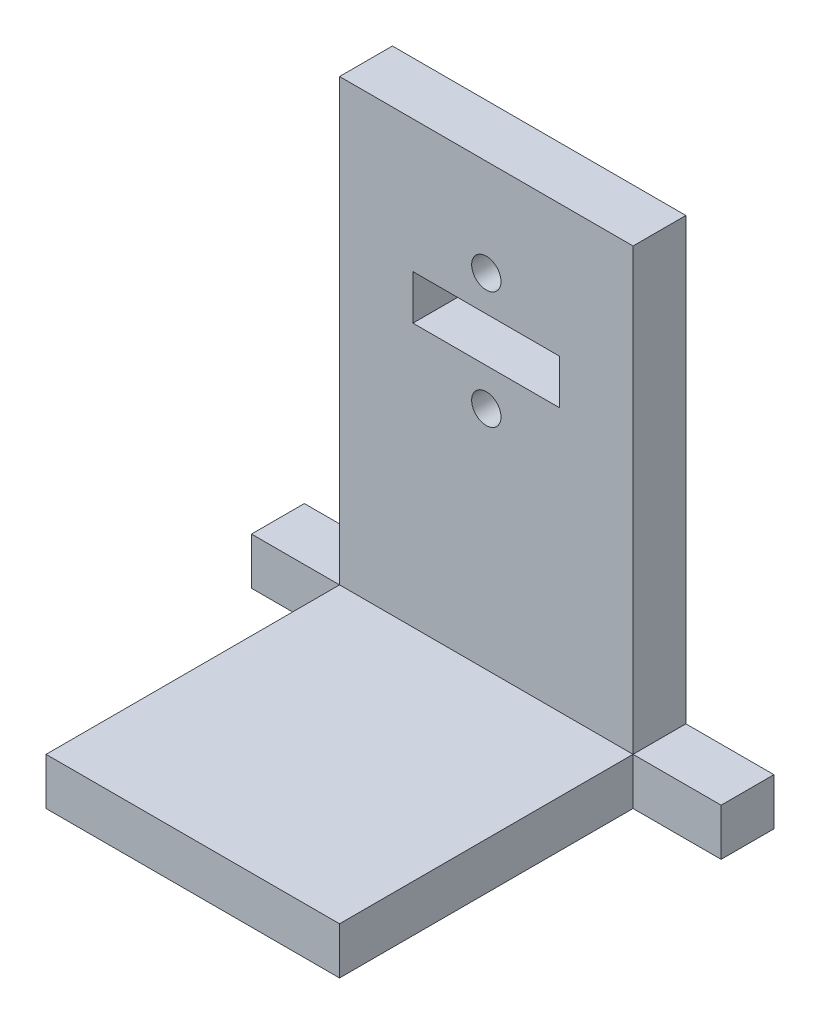
ISO-10303-21;
HEADER;
FILE_DESCRIPTION(('STEP AP214'),'2;1');
FILE_NAME('part.step','',(''),(''),'','','');
FILE_SCHEMA(('AUTOMOTIVE_DESIGN { 1 0 10303 214 1 1 1 1 }'));
ENDSEC;
DATA;
#1=APPLICATION_CONTEXT('core data for automotive mechanical design processes');
#2=APPLICATION_PROTOCOL_DEFINITION('international standard','automotive_design',2000,#1);
#3=PRODUCT_CONTEXT('',#1,'mechanical');
#4=PRODUCT('Part','Part','',(#3));
#5=PRODUCT_RELATED_PRODUCT_CATEGORY('part','',(#4));
#6=PRODUCT_DEFINITION_FORMATION('','',#4);
#7=PRODUCT_DEFINITION_CONTEXT('part definition',#1,'design');
#8=PRODUCT_DEFINITION('design','',#6,#7);
#9=PRODUCT_DEFINITION_SHAPE('','',#8);
#10=(LENGTH_UNIT() NAMED_UNIT(*) SI_UNIT(.MILLI.,.METRE.));
#11=(NAMED_UNIT(*) PLANE_ANGLE_UNIT() SI_UNIT($,.RADIAN.));
#12=(NAMED_UNIT(*) SI_UNIT($,.STERADIAN.) SOLID_ANGLE_UNIT());
#13=UNCERTAINTY_MEASURE_WITH_UNIT(LENGTH_MEASURE(1.E-05),#10,'distance_accuracy_value','');
#14=(GEOMETRIC_REPRESENTATION_CONTEXT(3) GLOBAL_UNCERTAINTY_ASSIGNED_CONTEXT((#13)) GLOBAL_UNIT_ASSIGNED_CONTEXT((#10,
#11,#12)) REPRESENTATION_CONTEXT('',''));
#15=CARTESIAN_POINT('',(0.,0.,0.));
#16=DIRECTION('',(0.,0.,1.));
#17=DIRECTION('',(1.,0.,0.));
#18=AXIS2_PLACEMENT_3D('',#15,#16,#17);
#19=CARTESIAN_POINT('',(0.,0.,0.));
#20=DIRECTION('',(0.,0.,1.));
#21=DIRECTION('',(1.,0.,0.));
#22=AXIS2_PLACEMENT_3D('',#19,#20,#21);
#23=PLANE('',#22);
#24=DIRECTION('',(0.,-1.,0.));
#25=VECTOR('',#24,1.);
#26=CARTESIAN_POINT('',(16.5532367821159,8.00000000000011,0.));
#27=LINE('',#26,#25);
#28=CARTESIAN_POINT('',(16.5532367821159,8.00000000000011,0.));
#29=VERTEX_POINT('',#28);
#30=CARTESIAN_POINT('',(16.5532367821159,0.,0.));
#31=VERTEX_POINT('',#30);
#32=EDGE_CURVE('E37',#29,#31,#27,.T.);
#33=ORIENTED_EDGE('',*,*,#32,.F.);
#34=DIRECTION('',(-1.,0.,0.));
#35=VECTOR('',#34,1.);
#36=CARTESIAN_POINT('',(16.5532367821159,8.00000000000011,0.));
#37=LINE('',#36,#35);
#38=CARTESIAN_POINT('',(1.55323678211588,8.00000000000011,0.));
#39=VERTEX_POINT('',#38);
#40=EDGE_CURVE('E206',#29,#39,#37,.T.);
#41=ORIENTED_EDGE('',*,*,#40,.T.);
#42=DIRECTION('',(0.,-1.,0.));
#43=VECTOR('',#42,1.);
#44=CARTESIAN_POINT('',(1.55323678211588,8.00000000000011,0.));
#45=LINE('',#44,#43);
#46=CARTESIAN_POINT('',(1.55323678211589,1.11022302462516E-13,0.));
#47=VERTEX_POINT('',#46);
#48=EDGE_CURVE('E184',#39,#47,#45,.T.);
#49=ORIENTED_EDGE('',*,*,#48,.T.);
#50=DIRECTION('',(1.,0.,0.));
#51=VECTOR('',#50,1.);
#52=CARTESIAN_POINT('',(1.55323678211589,1.11022302462516E-13,0.));
#53=LINE('',#52,#51);
#54=EDGE_CURVE('E59',#47,#31,#53,.T.);
#55=ORIENTED_EDGE('',*,*,#54,.T.);
#56=EDGE_LOOP('',(#33,#41,#49,#55));
#57=FACE_BOUND('',#56,.T.);
#58=ADVANCED_FACE('F33',(#57),#23,.T.);
#59=CARTESIAN_POINT('',(1.55323678211588,8.00000000000011,-9.));
#60=DIRECTION('',(-1.,0.,0.));
#61=DIRECTION('',(0.,-1.,0.));
#62=AXIS2_PLACEMENT_3D('',#59,#60,#61);
#63=PLANE('',#62);
#64=ORIENTED_EDGE('',*,*,#48,.F.);
#65=DIRECTION('',(0.,0.,1.));
#66=VECTOR('',#65,1.);
#67=CARTESIAN_POINT('',(1.55323678211588,8.00000000000011,-9.));
#68=LINE('',#67,#66);
#69=CARTESIAN_POINT('',(1.55323678211588,8.00000000000011,-9.));
#70=VERTEX_POINT('',#69);
#71=EDGE_CURVE('E11',#70,#39,#68,.T.);
#72=ORIENTED_EDGE('',*,*,#71,.F.);
#73=DIRECTION('',(0.,-1.,0.));
#74=VECTOR('',#73,1.);
#75=CARTESIAN_POINT('',(1.55323678211588,8.00000000000011,-9.));
#76=LINE('',#75,#74);
#77=CARTESIAN_POINT('',(1.55323678211589,1.11022302462516E-13,-9.));
#78=VERTEX_POINT('',#77);
#79=EDGE_CURVE('E208',#70,#78,#76,.T.);
#80=ORIENTED_EDGE('',*,*,#79,.T.);
#81=DIRECTION('',(0.,0.,1.));
#82=VECTOR('',#81,1.);
#83=CARTESIAN_POINT('',(1.55323678211589,1.11022302462516E-13,-9.));
#84=LINE('',#83,#82);
#85=EDGE_CURVE('E222',#78,#47,#84,.T.);
#86=ORIENTED_EDGE('',*,*,#85,.T.);
#87=EDGE_LOOP('',(#64,#72,#80,#86));
#88=FACE_BOUND('',#87,.T.);
#89=ADVANCED_FACE('F35',(#88),#63,.T.);
#90=CARTESIAN_POINT('',(16.5532367821159,8.00000000000011,-9.));
#91=DIRECTION('',(0.,1.,0.));
#92=DIRECTION('',(-1.,0.,0.));
#93=AXIS2_PLACEMENT_3D('',#90,#91,#92);
#94=PLANE('',#93);
#95=ORIENTED_EDGE('',*,*,#40,.F.);
#96=DIRECTION('',(0.,0.,1.));
#97=VECTOR('',#96,1.);
#98=CARTESIAN_POINT('',(16.5532367821159,8.00000000000011,-9.));
#99=LINE('',#98,#97);
#100=CARTESIAN_POINT('',(16.5532367821159,8.00000000000011,-9.));
#101=VERTEX_POINT('',#100);
#102=EDGE_CURVE('E43',#101,#29,#99,.T.);
#103=ORIENTED_EDGE('',*,*,#102,.F.);
#104=DIRECTION('',(-1.,0.,0.));
#105=VECTOR('',#104,1.);
#106=CARTESIAN_POINT('',(16.5532367821159,8.00000000000011,-9.));
#107=LINE('',#106,#105);
#108=EDGE_CURVE('E223',#101,#70,#107,.T.);
#109=ORIENTED_EDGE('',*,*,#108,.T.);
#110=ORIENTED_EDGE('',*,*,#71,.T.);
#111=EDGE_LOOP('',(#95,#103,#109,#110));
#112=FACE_BOUND('',#111,.T.);
#113=ADVANCED_FACE('F310',(#112),#94,.T.);
#114=CARTESIAN_POINT('',(16.5532367821159,83.0000000000001,-9.));
#115=DIRECTION('',(-1.,0.,0.));
#116=DIRECTION('',(0.,-1.,0.));
#117=AXIS2_PLACEMENT_3D('',#114,#115,#116);
#118=PLANE('',#117);
#119=DIRECTION('',(0.,-1.,0.));
#120=VECTOR('',#119,1.);
#121=CARTESIAN_POINT('',(16.5532367821159,83.0000000000001,0.));
#122=LINE('',#121,#120);
#123=CARTESIAN_POINT('',(16.5532367821159,83.0000000000001,0.));
#124=VERTEX_POINT('',#123);
#125=EDGE_CURVE('E203',#124,#29,#122,.T.);
#126=ORIENTED_EDGE('',*,*,#125,.F.);
#127=DIRECTION('',(0.,0.,1.));
#128=VECTOR('',#127,1.);
#129=CARTESIAN_POINT('',(16.5532367821159,83.0000000000001,-9.));
#130=LINE('',#129,#128);
#131=CARTESIAN_POINT('',(16.5532367821159,83.0000000000001,-9.));
#132=VERTEX_POINT('',#131);
#133=EDGE_CURVE('E212',#132,#124,#130,.T.);
#134=ORIENTED_EDGE('',*,*,#133,.F.);
#135=DIRECTION('',(0.,-1.,0.));
#136=VECTOR('',#135,1.);
#137=CARTESIAN_POINT('',(16.5532367821159,83.0000000000001,-9.));
#138=LINE('',#137,#136);
#139=EDGE_CURVE('E228',#132,#101,#138,.T.);
#140=ORIENTED_EDGE('',*,*,#139,.T.);
#141=ORIENTED_EDGE('',*,*,#102,.T.);
#142=EDGE_LOOP('',(#126,#134,#140,#141));
#143=FACE_BOUND('',#142,.T.);
#144=ADVANCED_FACE('F311',(#143),#118,.T.);
#145=CARTESIAN_POINT('',(66.5532367821157,83.0000000000001,-9.));
#146=DIRECTION('',(0.,1.,0.));
#147=DIRECTION('',(-1.,0.,0.));
#148=AXIS2_PLACEMENT_3D('',#145,#146,#147);
#149=PLANE('',#148);
#150=DIRECTION('',(-1.,0.,0.));
#151=VECTOR('',#150,1.);
#152=CARTESIAN_POINT('',(66.5532367821157,83.0000000000001,0.));
#153=LINE('',#152,#151);
#154=CARTESIAN_POINT('',(66.5532367821157,83.0000000000001,0.));
#155=VERTEX_POINT('',#154);
#156=EDGE_CURVE('E200',#155,#124,#153,.T.);
#157=ORIENTED_EDGE('',*,*,#156,.F.);
#158=DIRECTION('',(0.,0.,1.));
#159=VECTOR('',#158,1.);
#160=CARTESIAN_POINT('',(66.5532367821157,83.0000000000001,-9.));
#161=LINE('',#160,#159);
#162=CARTESIAN_POINT('',(66.5532367821157,83.0000000000001,-9.));
#163=VERTEX_POINT('',#162);
#164=EDGE_CURVE('E214',#163,#155,#161,.T.);
#165=ORIENTED_EDGE('',*,*,#164,.F.);
#166=DIRECTION('',(-1.,0.,0.));
#167=VECTOR('',#166,1.);
#168=CARTESIAN_POINT('',(66.5532367821157,83.0000000000001,-9.));
#169=LINE('',#168,#167);
#170=EDGE_CURVE('E232',#163,#132,#169,.T.);
#171=ORIENTED_EDGE('',*,*,#170,.T.);
#172=ORIENTED_EDGE('',*,*,#133,.T.);
#173=EDGE_LOOP('',(#157,#165,#171,#172));
#174=FACE_BOUND('',#173,.T.);
#175=ADVANCED_FACE('F444',(#174),#149,.T.);
#176=CARTESIAN_POINT('',(66.5532367821157,8.,-9.));
#177=DIRECTION('',(1.,0.,0.));
#178=DIRECTION('',(0.,1.,0.));
#179=AXIS2_PLACEMENT_3D('',#176,#177,#178);
#180=PLANE('',#179);
#181=DIRECTION('',(0.,1.,0.));
#182=VECTOR('',#181,1.);
#183=CARTESIAN_POINT('',(66.5532367821157,8.,0.));
#184=LINE('',#183,#182);
#185=CARTESIAN_POINT('',(66.5532367821157,8.,0.));
#186=VERTEX_POINT('',#185);
#187=EDGE_CURVE('E197',#186,#155,#184,.T.);
#188=ORIENTED_EDGE('',*,*,#187,.F.);
#189=DIRECTION('',(0.,0.,1.));
#190=VECTOR('',#189,1.);
#191=CARTESIAN_POINT('',(66.5532367821157,8.,-9.));
#192=LINE('',#191,#190);
#193=CARTESIAN_POINT('',(66.5532367821157,8.,-9.));
#194=VERTEX_POINT('',#193);
#195=EDGE_CURVE('E216',#194,#186,#192,.T.);
#196=ORIENTED_EDGE('',*,*,#195,.F.);
#197=DIRECTION('',(0.,1.,0.));
#198=VECTOR('',#197,1.);
#199=CARTESIAN_POINT('',(66.5532367821157,8.,-9.));
#200=LINE('',#199,#198);
#201=EDGE_CURVE('E237',#194,#163,#200,.T.);
#202=ORIENTED_EDGE('',*,*,#201,.T.);
#203=ORIENTED_EDGE('',*,*,#164,.T.);
#204=EDGE_LOOP('',(#188,#196,#202,#203));
#205=FACE_BOUND('',#204,.T.);
#206=ADVANCED_FACE('F434',(#205),#180,.T.);
#207=CARTESIAN_POINT('',(81.5532367821157,8.,-9.));
#208=DIRECTION('',(0.,1.,0.));
#209=DIRECTION('',(-1.,0.,0.));
#210=AXIS2_PLACEMENT_3D('',#207,#208,#209);
#211=PLANE('',#210);
#212=DIRECTION('',(-1.,0.,0.));
#213=VECTOR('',#212,1.);
#214=CARTESIAN_POINT('',(81.5532367821157,8.,0.));
#215=LINE('',#214,#213);
#216=CARTESIAN_POINT('',(81.5532367821157,8.,0.));
#217=VERTEX_POINT('',#216);
#218=EDGE_CURVE('E194',#217,#186,#215,.T.);
#219=ORIENTED_EDGE('',*,*,#218,.F.);
#220=DIRECTION('',(0.,0.,1.));
#221=VECTOR('',#220,1.);
#222=CARTESIAN_POINT('',(81.5532367821157,8.,-9.));
#223=LINE('',#222,#221);
#224=CARTESIAN_POINT('',(81.5532367821157,8.,-9.));
#225=VERTEX_POINT('',#224);
#226=EDGE_CURVE('E218',#225,#217,#223,.T.);
#227=ORIENTED_EDGE('',*,*,#226,.F.);
#228=DIRECTION('',(-1.,0.,0.));
#229=VECTOR('',#228,1.);
#230=CARTESIAN_POINT('',(81.5532367821157,8.,-9.));
#231=LINE('',#230,#229);
#232=EDGE_CURVE('E240',#225,#194,#231,.T.);
#233=ORIENTED_EDGE('',*,*,#232,.T.);
#234=ORIENTED_EDGE('',*,*,#195,.T.);
#235=EDGE_LOOP('',(#219,#227,#233,#234));
#236=FACE_BOUND('',#235,.T.);
#237=ADVANCED_FACE('F424',(#236),#211,.T.);
#238=CARTESIAN_POINT('',(81.5532367821157,0.,-9.));
#239=DIRECTION('',(1.,0.,0.));
#240=DIRECTION('',(0.,0.,-1.));
#241=AXIS2_PLACEMENT_3D('',#238,#239,#240);
#242=PLANE('',#241);
#243=DIRECTION('',(0.,1.,0.));
#244=VECTOR('',#243,1.);
#245=CARTESIAN_POINT('',(81.5532367821157,0.,0.));
#246=LINE('',#245,#244);
#247=CARTESIAN_POINT('',(81.5532367821157,0.,0.));
#248=VERTEX_POINT('',#247);
#249=EDGE_CURVE('E190',#248,#217,#246,.T.);
#250=ORIENTED_EDGE('',*,*,#249,.F.);
#251=DIRECTION('',(0.,0.,1.));
#252=VECTOR('',#251,1.);
#253=CARTESIAN_POINT('',(81.5532367821157,0.,-9.));
#254=LINE('',#253,#252);
#255=CARTESIAN_POINT('',(81.5532367821157,0.,-9.));
#256=VERTEX_POINT('',#255);
#257=EDGE_CURVE('E220',#256,#248,#254,.T.);
#258=ORIENTED_EDGE('',*,*,#257,.F.);
#259=DIRECTION('',(0.,1.,0.));
#260=VECTOR('',#259,1.);
#261=CARTESIAN_POINT('',(81.5532367821157,0.,-9.));
#262=LINE('',#261,#260);
#263=EDGE_CURVE('E243',#256,#225,#262,.T.);
#264=ORIENTED_EDGE('',*,*,#263,.T.);
#265=ORIENTED_EDGE('',*,*,#226,.T.);
#266=EDGE_LOOP('',(#250,#258,#264,#265));
#267=FACE_BOUND('',#266,.T.);
#268=ADVANCED_FACE('F342',(#267),#242,.T.);
#269=CARTESIAN_POINT('',(1.55323678211589,1.11022302462516E-13,-9.));
#270=DIRECTION('',(0.,-1.,0.));
#271=DIRECTION('',(1.,0.,0.));
#272=AXIS2_PLACEMENT_3D('',#269,#270,#271);
#273=PLANE('',#272);
#274=ORIENTED_EDGE('',*,*,#54,.F.);
#275=ORIENTED_EDGE('',*,*,#85,.F.);
#276=DIRECTION('',(1.,0.,0.));
#277=VECTOR('',#276,1.);
#278=CARTESIAN_POINT('',(1.55323678211589,1.11022302462516E-13,-9.));
#279=LINE('',#278,#277);
#280=EDGE_CURVE('E246',#78,#256,#279,.T.);
#281=ORIENTED_EDGE('',*,*,#280,.T.);
#282=ORIENTED_EDGE('',*,*,#257,.T.);
#283=CARTESIAN_POINT('',(66.5506775303299,0.,0.));
#284=VERTEX_POINT('',#283);
#285=EDGE_CURVE('E181',#284,#248,#53,.T.);
#286=ORIENTED_EDGE('',*,*,#285,.F.);
#287=DIRECTION('',(0.,0.,-1.));
#288=VECTOR('',#287,1.);
#289=CARTESIAN_POINT('',(66.5506775303299,0.,50.));
#290=LINE('',#289,#288);
#291=CARTESIAN_POINT('',(66.5506775303299,0.,50.));
#292=VERTEX_POINT('',#291);
#293=EDGE_CURVE('E152',#292,#284,#290,.T.);
#294=ORIENTED_EDGE('',*,*,#293,.F.);
#295=DIRECTION('',(1.,0.,0.));
#296=VECTOR('',#295,1.);
#297=CARTESIAN_POINT('',(16.5532367821159,0.,50.));
#298=LINE('',#297,#296);
#299=CARTESIAN_POINT('',(16.5532367821159,0.,50.));
#300=VERTEX_POINT('',#299);
#301=EDGE_CURVE('E145',#300,#292,#298,.T.);
#302=ORIENTED_EDGE('',*,*,#301,.F.);
#303=DIRECTION('',(0.,0.,-1.));
#304=VECTOR('',#303,1.);
#305=CARTESIAN_POINT('',(16.5532367821159,0.,50.));
#306=LINE('',#305,#304);
#307=EDGE_CURVE('E149',#300,#31,#306,.T.);
#308=ORIENTED_EDGE('',*,*,#307,.T.);
#309=EDGE_LOOP('',(#274,#275,#281,#282,#286,#294,#302,#308));
#310=FACE_BOUND('',#309,.T.);
#311=ADVANCED_FACE('F147',(#310),#273,.T.);
#312=CARTESIAN_POINT('',(0.,0.,-9.));
#313=DIRECTION('',(0.,0.,1.));
#314=DIRECTION('',(1.,0.,0.));
#315=AXIS2_PLACEMENT_3D('',#312,#313,#314);
#316=PLANE('',#315);
#317=DIRECTION('',(-1.,0.,0.));
#318=VECTOR('',#317,1.);
#319=CARTESIAN_POINT('',(54.0532367821157,60.4723835611167,-9.));
#320=LINE('',#319,#318);
#321=CARTESIAN_POINT('',(54.0532367821157,60.4723835611167,-9.));
#322=VERTEX_POINT('',#321);
#323=CARTESIAN_POINT('',(29.0532367821157,60.4723835611167,-9.));
#324=VERTEX_POINT('',#323);
#325=EDGE_CURVE('E267',#322,#324,#320,.T.);
#326=ORIENTED_EDGE('',*,*,#325,.T.);
#327=DIRECTION('',(0.,-1.,0.));
#328=VECTOR('',#327,1.);
#329=CARTESIAN_POINT('',(29.0532367821157,60.4723835611167,-9.));
#330=LINE('',#329,#328);
#331=CARTESIAN_POINT('',(29.0532367821157,52.863238695691,-9.));
#332=VERTEX_POINT('',#331);
#333=EDGE_CURVE('E275',#324,#332,#330,.T.);
#334=ORIENTED_EDGE('',*,*,#333,.T.);
#335=DIRECTION('',(1.,0.,0.));
#336=VECTOR('',#335,1.);
#337=CARTESIAN_POINT('',(29.0532367821157,52.863238695691,-9.));
#338=LINE('',#337,#336);
#339=CARTESIAN_POINT('',(54.0532367821157,52.863238695691,-9.));
#340=VERTEX_POINT('',#339);
#341=EDGE_CURVE('E286',#332,#340,#338,.T.);
#342=ORIENTED_EDGE('',*,*,#341,.T.);
#343=DIRECTION('',(0.,1.,0.));
#344=VECTOR('',#343,1.);
#345=CARTESIAN_POINT('',(54.0532367821157,60.4723835611167,-9.));
#346=LINE('',#345,#344);
#347=EDGE_CURVE('E283',#340,#322,#346,.T.);
#348=ORIENTED_EDGE('',*,*,#347,.T.);
#349=EDGE_LOOP('',(#326,#334,#342,#348));
#350=FACE_BOUND('',#349,.T.);
#351=CARTESIAN_POINT('',(41.5532367821157,66.5,-9.));
#352=DIRECTION('',(0.,0.,1.));
#353=DIRECTION('',(1.,0.,0.));
#354=AXIS2_PLACEMENT_3D('',#351,#352,#353);
#355=CIRCLE('',#354,2.5);
#356=CARTESIAN_POINT('',(44.0532367821157,66.5,-9.));
#357=VERTEX_POINT('',#356);
#358=EDGE_CURVE('E254',#357,#357,#355,.T.);
#359=ORIENTED_EDGE('',*,*,#358,.T.);
#360=EDGE_LOOP('',(#359));
#361=FACE_BOUND('',#360,.T.);
#362=CARTESIAN_POINT('',(41.5532367821157,46.5,-9.));
#363=DIRECTION('',(0.,0.,1.));
#364=DIRECTION('',(1.,0.,0.));
#365=AXIS2_PLACEMENT_3D('',#362,#363,#364);
#366=CIRCLE('',#365,2.5);
#367=CARTESIAN_POINT('',(44.0532367821157,46.5,-9.));
#368=VERTEX_POINT('',#367);
#369=EDGE_CURVE('E253',#368,#368,#366,.T.);
#370=ORIENTED_EDGE('',*,*,#369,.T.);
#371=EDGE_LOOP('',(#370));
#372=FACE_BOUND('',#371,.T.);
#373=ORIENTED_EDGE('',*,*,#79,.F.);
#374=ORIENTED_EDGE('',*,*,#108,.F.);
#375=ORIENTED_EDGE('',*,*,#139,.F.);
#376=ORIENTED_EDGE('',*,*,#170,.F.);
#377=ORIENTED_EDGE('',*,*,#201,.F.);
#378=ORIENTED_EDGE('',*,*,#232,.F.);
#379=ORIENTED_EDGE('',*,*,#263,.F.);
#380=ORIENTED_EDGE('',*,*,#280,.F.);
#381=EDGE_LOOP('',(#373,#374,#375,#376,#377,#378,#379,#380));
#382=FACE_BOUND('',#381,.T.);
#383=ADVANCED_FACE('F316',(#350,#361,#372,#382),#316,.F.);
#384=DIRECTION('',(-1.,0.,0.));
#385=VECTOR('',#384,1.);
#386=CARTESIAN_POINT('',(16.5532367821159,8.00000000000011,0.));
#387=LINE('',#386,#385);
#388=CARTESIAN_POINT('',(66.5506775303299,8.00000000000011,0.));
#389=VERTEX_POINT('',#388);
#390=EDGE_CURVE('E165',#389,#29,#387,.T.);
#391=ORIENTED_EDGE('',*,*,#390,.F.);
#392=DIRECTION('',(0.,1.,0.));
#393=VECTOR('',#392,1.);
#394=CARTESIAN_POINT('',(66.5506775303299,8.00000000000011,0.));
#395=LINE('',#394,#393);
#396=EDGE_CURVE('E51',#284,#389,#395,.T.);
#397=ORIENTED_EDGE('',*,*,#396,.F.);
#398=ORIENTED_EDGE('',*,*,#285,.T.);
#399=ORIENTED_EDGE('',*,*,#249,.T.);
#400=ORIENTED_EDGE('',*,*,#218,.T.);
#401=ORIENTED_EDGE('',*,*,#187,.T.);
#402=ORIENTED_EDGE('',*,*,#156,.T.);
#403=ORIENTED_EDGE('',*,*,#125,.T.);
#404=EDGE_LOOP('',(#391,#397,#398,#399,#400,#401,#402,#403));
#405=FACE_BOUND('',#404,.T.);
#406=DIRECTION('',(0.,-1.,0.));
#407=VECTOR('',#406,1.);
#408=CARTESIAN_POINT('',(29.0532367821157,60.4723835611167,0.));
#409=LINE('',#408,#407);
#410=CARTESIAN_POINT('',(29.0532367821157,60.4723835611167,0.));
#411=VERTEX_POINT('',#410);
#412=CARTESIAN_POINT('',(29.0532367821157,52.863238695691,0.));
#413=VERTEX_POINT('',#412);
#414=EDGE_CURVE('E168',#411,#413,#409,.T.);
#415=ORIENTED_EDGE('',*,*,#414,.F.);
#416=DIRECTION('',(-1.,0.,0.));
#417=VECTOR('',#416,1.);
#418=CARTESIAN_POINT('',(54.0532367821157,60.4723835611167,0.));
#419=LINE('',#418,#417);
#420=CARTESIAN_POINT('',(54.0532367821157,60.4723835611167,0.));
#421=VERTEX_POINT('',#420);
#422=EDGE_CURVE('E272',#421,#411,#419,.T.);
#423=ORIENTED_EDGE('',*,*,#422,.F.);
#424=DIRECTION('',(0.,1.,0.));
#425=VECTOR('',#424,1.);
#426=CARTESIAN_POINT('',(54.0532367821157,60.4723835611167,0.));
#427=LINE('',#426,#425);
#428=CARTESIAN_POINT('',(54.0532367821157,52.863238695691,0.));
#429=VERTEX_POINT('',#428);
#430=EDGE_CURVE('E276',#429,#421,#427,.T.);
#431=ORIENTED_EDGE('',*,*,#430,.F.);
#432=DIRECTION('',(1.,0.,0.));
#433=VECTOR('',#432,1.);
#434=CARTESIAN_POINT('',(29.0532367821157,52.863238695691,0.));
#435=LINE('',#434,#433);
#436=EDGE_CURVE('E170',#413,#429,#435,.T.);
#437=ORIENTED_EDGE('',*,*,#436,.F.);
#438=EDGE_LOOP('',(#415,#423,#431,#437));
#439=FACE_BOUND('',#438,.T.);
#440=CARTESIAN_POINT('',(41.5532367821157,66.5,0.));
#441=DIRECTION('',(0.,0.,1.));
#442=DIRECTION('',(1.,0.,0.));
#443=AXIS2_PLACEMENT_3D('',#440,#441,#442);
#444=CIRCLE('',#443,2.5);
#445=CARTESIAN_POINT('',(44.0532367821157,66.5,0.));
#446=VERTEX_POINT('',#445);
#447=EDGE_CURVE('E257',#446,#446,#444,.T.);
#448=ORIENTED_EDGE('',*,*,#447,.F.);
#449=EDGE_LOOP('',(#448));
#450=FACE_BOUND('',#449,.T.);
#451=CARTESIAN_POINT('',(41.5532367821157,46.5,0.));
#452=DIRECTION('',(0.,0.,1.));
#453=DIRECTION('',(1.,0.,0.));
#454=AXIS2_PLACEMENT_3D('',#451,#452,#453);
#455=CIRCLE('',#454,2.5);
#456=CARTESIAN_POINT('',(44.0532367821157,46.5,0.));
#457=VERTEX_POINT('',#456);
#458=EDGE_CURVE('E250',#457,#457,#455,.T.);
#459=ORIENTED_EDGE('',*,*,#458,.F.);
#460=EDGE_LOOP('',(#459));
#461=FACE_BOUND('',#460,.T.);
#462=ADVANCED_FACE('F304',(#405,#439,#450,#461),#23,.T.);
#463=CARTESIAN_POINT('',(41.5532367821157,46.5,-9.));
#464=DIRECTION('',(0.,0.,1.));
#465=DIRECTION('',(1.,0.,0.));
#466=AXIS2_PLACEMENT_3D('',#463,#464,#465);
#467=CYLINDRICAL_SURFACE('',#466,2.5);
#468=ORIENTED_EDGE('',*,*,#369,.F.);
#469=EDGE_LOOP('',(#468));
#470=FACE_BOUND('',#469,.T.);
#471=ORIENTED_EDGE('',*,*,#458,.T.);
#472=EDGE_LOOP('',(#471));
#473=FACE_BOUND('',#472,.T.);
#474=ADVANCED_FACE('F330',(#470,#473),#467,.F.);
#475=CARTESIAN_POINT('',(41.5532367821157,66.5,-9.));
#476=DIRECTION('',(0.,0.,1.));
#477=DIRECTION('',(1.,0.,0.));
#478=AXIS2_PLACEMENT_3D('',#475,#476,#477);
#479=CYLINDRICAL_SURFACE('',#478,2.5);
#480=ORIENTED_EDGE('',*,*,#358,.F.);
#481=EDGE_LOOP('',(#480));
#482=FACE_BOUND('',#481,.T.);
#483=ORIENTED_EDGE('',*,*,#447,.T.);
#484=EDGE_LOOP('',(#483));
#485=FACE_BOUND('',#484,.T.);
#486=ADVANCED_FACE('F335',(#482,#485),#479,.F.);
#487=CARTESIAN_POINT('',(29.0532367821157,60.4723835611167,-9.));
#488=DIRECTION('',(-1.,0.,0.));
#489=DIRECTION('',(0.,-1.,0.));
#490=AXIS2_PLACEMENT_3D('',#487,#488,#489);
#491=PLANE('',#490);
#492=ORIENTED_EDGE('',*,*,#414,.T.);
#493=DIRECTION('',(0.,0.,1.));
#494=VECTOR('',#493,1.);
#495=CARTESIAN_POINT('',(29.0532367821157,52.863238695691,-9.));
#496=LINE('',#495,#494);
#497=EDGE_CURVE('E263',#332,#413,#496,.T.);
#498=ORIENTED_EDGE('',*,*,#497,.F.);
#499=ORIENTED_EDGE('',*,*,#333,.F.);
#500=DIRECTION('',(0.,0.,1.));
#501=VECTOR('',#500,1.);
#502=CARTESIAN_POINT('',(29.0532367821157,60.4723835611167,-9.));
#503=LINE('',#502,#501);
#504=EDGE_CURVE('E260',#324,#411,#503,.T.);
#505=ORIENTED_EDGE('',*,*,#504,.T.);
#506=EDGE_LOOP('',(#492,#498,#499,#505));
#507=FACE_BOUND('',#506,.T.);
#508=ADVANCED_FACE('F347',(#507),#491,.F.);
#509=CARTESIAN_POINT('',(54.0532367821157,60.4723835611167,-9.));
#510=DIRECTION('',(0.,1.,0.));
#511=DIRECTION('',(-1.,0.,0.));
#512=AXIS2_PLACEMENT_3D('',#509,#510,#511);
#513=PLANE('',#512);
#514=ORIENTED_EDGE('',*,*,#422,.T.);
#515=ORIENTED_EDGE('',*,*,#504,.F.);
#516=ORIENTED_EDGE('',*,*,#325,.F.);
#517=DIRECTION('',(0.,0.,1.));
#518=VECTOR('',#517,1.);
#519=CARTESIAN_POINT('',(54.0532367821157,60.4723835611167,-9.));
#520=LINE('',#519,#518);
#521=EDGE_CURVE('E269',#322,#421,#520,.T.);
#522=ORIENTED_EDGE('',*,*,#521,.T.);
#523=EDGE_LOOP('',(#514,#515,#516,#522));
#524=FACE_BOUND('',#523,.T.);
#525=ADVANCED_FACE('F351',(#524),#513,.F.);
#526=CARTESIAN_POINT('',(54.0532367821157,60.4723835611167,-9.));
#527=DIRECTION('',(1.,0.,0.));
#528=DIRECTION('',(0.,1.,0.));
#529=AXIS2_PLACEMENT_3D('',#526,#527,#528);
#530=PLANE('',#529);
#531=ORIENTED_EDGE('',*,*,#430,.T.);
#532=ORIENTED_EDGE('',*,*,#521,.F.);
#533=ORIENTED_EDGE('',*,*,#347,.F.);
#534=DIRECTION('',(0.,0.,1.));
#535=VECTOR('',#534,1.);
#536=CARTESIAN_POINT('',(54.0532367821157,52.863238695691,-9.));
#537=LINE('',#536,#535);
#538=EDGE_CURVE('E266',#340,#429,#537,.T.);
#539=ORIENTED_EDGE('',*,*,#538,.T.);
#540=EDGE_LOOP('',(#531,#532,#533,#539));
#541=FACE_BOUND('',#540,.T.);
#542=ADVANCED_FACE('F356',(#541),#530,.F.);
#543=CARTESIAN_POINT('',(29.0532367821157,52.863238695691,-9.));
#544=DIRECTION('',(0.,-1.,0.));
#545=DIRECTION('',(0.,0.,-1.));
#546=AXIS2_PLACEMENT_3D('',#543,#544,#545);
#547=PLANE('',#546);
#548=ORIENTED_EDGE('',*,*,#436,.T.);
#549=ORIENTED_EDGE('',*,*,#538,.F.);
#550=ORIENTED_EDGE('',*,*,#341,.F.);
#551=ORIENTED_EDGE('',*,*,#497,.T.);
#552=EDGE_LOOP('',(#548,#549,#550,#551));
#553=FACE_BOUND('',#552,.T.);
#554=ADVANCED_FACE('F353',(#553),#547,.F.);
#555=CARTESIAN_POINT('',(16.5532367821159,8.00000000000011,50.));
#556=DIRECTION('',(1.,0.,0.));
#557=DIRECTION('',(0.,0.,-1.));
#558=AXIS2_PLACEMENT_3D('',#555,#556,#557);
#559=PLANE('',#558);
#560=ORIENTED_EDGE('',*,*,#32,.T.);
#561=ORIENTED_EDGE('',*,*,#307,.F.);
#562=DIRECTION('',(0.,-1.,0.));
#563=VECTOR('',#562,1.);
#564=CARTESIAN_POINT('',(16.5532367821159,8.00000000000011,50.));
#565=LINE('',#564,#563);
#566=CARTESIAN_POINT('',(16.5532367821159,8.00000000000011,50.));
#567=VERTEX_POINT('',#566);
#568=EDGE_CURVE('E156',#567,#300,#565,.T.);
#569=ORIENTED_EDGE('',*,*,#568,.F.);
#570=DIRECTION('',(0.,0.,-1.));
#571=VECTOR('',#570,1.);
#572=CARTESIAN_POINT('',(16.5532367821159,8.00000000000011,50.));
#573=LINE('',#572,#571);
#574=EDGE_CURVE('E293',#567,#29,#573,.T.);
#575=ORIENTED_EDGE('',*,*,#574,.T.);
#576=EDGE_LOOP('',(#560,#561,#569,#575));
#577=FACE_BOUND('',#576,.T.);
#578=ADVANCED_FACE('F167',(#577),#559,.F.);
#579=CARTESIAN_POINT('',(66.5506775303299,8.00000000000011,50.));
#580=DIRECTION('',(-1.,0.,0.));
#581=DIRECTION('',(0.,0.,1.));
#582=AXIS2_PLACEMENT_3D('',#579,#580,#581);
#583=PLANE('',#582);
#584=ORIENTED_EDGE('',*,*,#396,.T.);
#585=DIRECTION('',(0.,0.,-1.));
#586=VECTOR('',#585,1.);
#587=CARTESIAN_POINT('',(66.5506775303299,8.00000000000011,50.));
#588=LINE('',#587,#586);
#589=CARTESIAN_POINT('',(66.5506775303299,8.00000000000011,50.));
#590=VERTEX_POINT('',#589);
#591=EDGE_CURVE('E172',#590,#389,#588,.T.);
#592=ORIENTED_EDGE('',*,*,#591,.F.);
#593=DIRECTION('',(0.,1.,0.));
#594=VECTOR('',#593,1.);
#595=CARTESIAN_POINT('',(66.5506775303299,8.00000000000011,50.));
#596=LINE('',#595,#594);
#597=EDGE_CURVE('E155',#292,#590,#596,.T.);
#598=ORIENTED_EDGE('',*,*,#597,.F.);
#599=ORIENTED_EDGE('',*,*,#293,.T.);
#600=EDGE_LOOP('',(#584,#592,#598,#599));
#601=FACE_BOUND('',#600,.T.);
#602=ADVANCED_FACE('F301',(#601),#583,.F.);
#603=CARTESIAN_POINT('',(16.5532367821159,8.00000000000011,50.));
#604=DIRECTION('',(0.,-1.,0.));
#605=DIRECTION('',(0.,0.,-1.));
#606=AXIS2_PLACEMENT_3D('',#603,#604,#605);
#607=PLANE('',#606);
#608=ORIENTED_EDGE('',*,*,#390,.T.);
#609=ORIENTED_EDGE('',*,*,#574,.F.);
#610=DIRECTION('',(-1.,0.,0.));
#611=VECTOR('',#610,1.);
#612=CARTESIAN_POINT('',(16.5532367821159,8.00000000000011,50.));
#613=LINE('',#612,#611);
#614=EDGE_CURVE('E161',#590,#567,#613,.T.);
#615=ORIENTED_EDGE('',*,*,#614,.F.);
#616=ORIENTED_EDGE('',*,*,#591,.T.);
#617=EDGE_LOOP('',(#608,#609,#615,#616));
#618=FACE_BOUND('',#617,.T.);
#619=ADVANCED_FACE('F303',(#618),#607,.F.);
#620=CARTESIAN_POINT('',(0.,0.,50.));
#621=DIRECTION('',(0.,0.,1.));
#622=DIRECTION('',(1.,0.,0.));
#623=AXIS2_PLACEMENT_3D('',#620,#621,#622);
#624=PLANE('',#623);
#625=ORIENTED_EDGE('',*,*,#568,.T.);
#626=ORIENTED_EDGE('',*,*,#301,.T.);
#627=ORIENTED_EDGE('',*,*,#597,.T.);
#628=ORIENTED_EDGE('',*,*,#614,.T.);
#629=EDGE_LOOP('',(#625,#626,#627,#628));
#630=FACE_BOUND('',#629,.T.);
#631=ADVANCED_FACE('F159',(#630),#624,.T.);
#632=CLOSED_SHELL('',(#58,#89,#113,#144,#175,#206,#237,#268,#311,#383,#462,#474,#486,#508,#525,
#542,#554,#578,#602,#619,#631));
#633=MANIFOLD_SOLID_BREP('B2',#632);
#634=ADVANCED_BREP_SHAPE_REPRESENTATION('',(#18,#633),#14);
#635=SHAPE_DEFINITION_REPRESENTATION(#9,#634);
ENDSEC;
END-ISO-10303-21;
